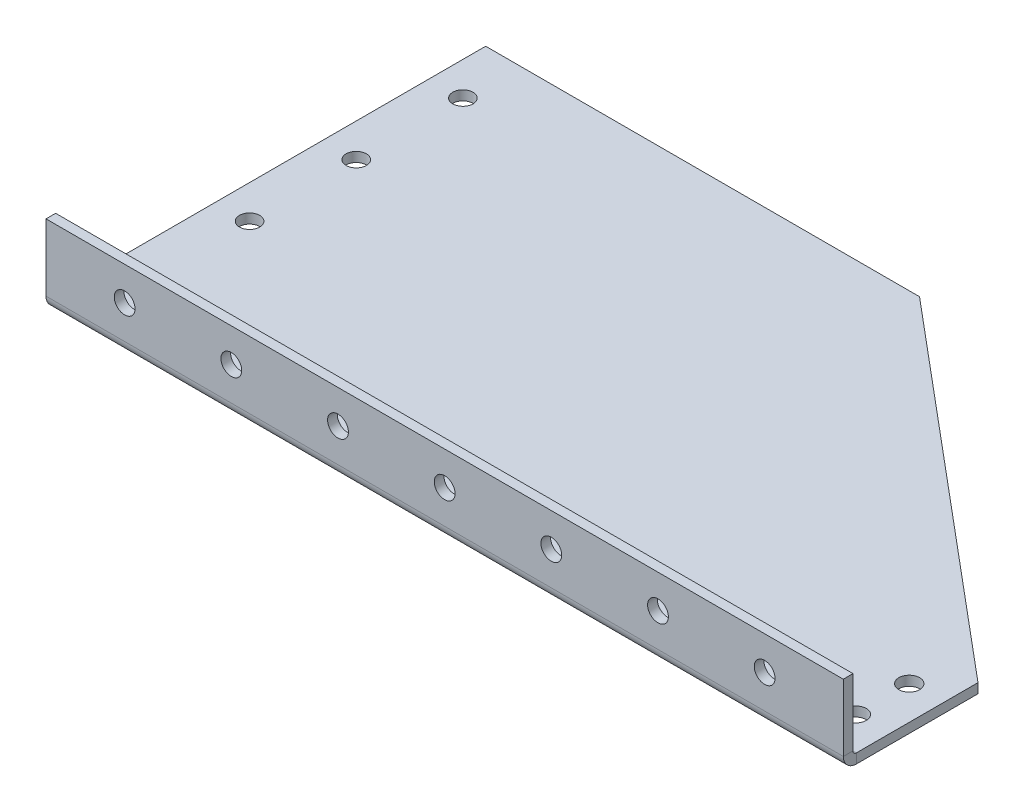
ISO-10303-21;
HEADER;
FILE_DESCRIPTION(('STEP AP214'),'2;1');
FILE_NAME('part.step','',(''),(''),'','','');
FILE_SCHEMA(('AUTOMOTIVE_DESIGN { 1 0 10303 214 1 1 1 1 }'));
ENDSEC;
DATA;
#1=APPLICATION_CONTEXT('core data for automotive mechanical design processes');
#2=APPLICATION_PROTOCOL_DEFINITION('international standard','automotive_design',2000,#1);
#3=PRODUCT_CONTEXT('',#1,'mechanical');
#4=PRODUCT('Part','Part','',(#3));
#5=PRODUCT_RELATED_PRODUCT_CATEGORY('part','',(#4));
#6=PRODUCT_DEFINITION_FORMATION('','',#4);
#7=PRODUCT_DEFINITION_CONTEXT('part definition',#1,'design');
#8=PRODUCT_DEFINITION('design','',#6,#7);
#9=PRODUCT_DEFINITION_SHAPE('','',#8);
#10=(LENGTH_UNIT() NAMED_UNIT(*) SI_UNIT(.MILLI.,.METRE.));
#11=(NAMED_UNIT(*) PLANE_ANGLE_UNIT() SI_UNIT($,.RADIAN.));
#12=(NAMED_UNIT(*) SI_UNIT($,.STERADIAN.) SOLID_ANGLE_UNIT());
#13=UNCERTAINTY_MEASURE_WITH_UNIT(LENGTH_MEASURE(1.E-05),#10,'distance_accuracy_value','');
#14=(GEOMETRIC_REPRESENTATION_CONTEXT(3) GLOBAL_UNCERTAINTY_ASSIGNED_CONTEXT((#13)) GLOBAL_UNIT_ASSIGNED_CONTEXT((#10,
#11,#12)) REPRESENTATION_CONTEXT('',''));
#15=CARTESIAN_POINT('',(0.,0.,0.));
#16=DIRECTION('',(0.,0.,1.));
#17=DIRECTION('',(1.,0.,0.));
#18=AXIS2_PLACEMENT_3D('',#15,#16,#17);
#19=CARTESIAN_POINT('',(106.398399999594,-2.3,80.677));
#20=DIRECTION('',(1.,0.,0.));
#21=DIRECTION('',(0.,0.,-1.));
#22=AXIS2_PLACEMENT_3D('',#19,#20,#21);
#23=PLANE('',#22);
#24=DIRECTION('',(0.,0.,-1.));
#25=VECTOR('',#24,1.);
#26=CARTESIAN_POINT('',(106.398399999594,-2.3,80.677));
#27=LINE('',#26,#25);
#28=CARTESIAN_POINT('',(106.398399999594,-2.30000000000001,79.8642));
#29=VERTEX_POINT('',#28);
#30=CARTESIAN_POINT('',(106.398399999594,-2.3,50.9046503403444));
#31=VERTEX_POINT('',#30);
#32=EDGE_CURVE('E59',#29,#31,#27,.T.);
#33=ORIENTED_EDGE('',*,*,#32,.T.);
#34=DIRECTION('',(0.,-1.,0.));
#35=VECTOR('',#34,1.);
#36=CARTESIAN_POINT('',(106.398399999594,16.75,50.9046503403444));
#37=LINE('',#36,#35);
#38=CARTESIAN_POINT('',(106.398399999594,0.,50.9046503403444));
#39=VERTEX_POINT('',#38);
#40=EDGE_CURVE('E134',#39,#31,#37,.T.);
#41=ORIENTED_EDGE('',*,*,#40,.F.);
#42=DIRECTION('',(0.,0.,-1.));
#43=VECTOR('',#42,1.);
#44=CARTESIAN_POINT('',(106.398399999594,0.,80.677));
#45=LINE('',#44,#43);
#46=CARTESIAN_POINT('',(106.398399999594,0.,79.8642000000001));
#47=VERTEX_POINT('',#46);
#48=EDGE_CURVE('E232',#47,#39,#45,.T.);
#49=ORIENTED_EDGE('',*,*,#48,.F.);
#50=DIRECTION('',(0.,-1.,0.));
#51=VECTOR('',#50,1.);
#52=CARTESIAN_POINT('',(106.398399999594,0.,79.8642000000001));
#53=LINE('',#52,#51);
#54=EDGE_CURVE('E209',#47,#29,#53,.T.);
#55=ORIENTED_EDGE('',*,*,#54,.T.);
#56=EDGE_LOOP('',(#33,#41,#49,#55));
#57=FACE_BOUND('',#56,.T.);
#58=ADVANCED_FACE('F50',(#57),#23,.T.);
#59=CARTESIAN_POINT('',(0.,-2.3,0.));
#60=DIRECTION('',(0.,1.,0.));
#61=DIRECTION('',(0.,0.,1.));
#62=AXIS2_PLACEMENT_3D('',#59,#60,#61);
#63=PLANE('',#62);
#64=CARTESIAN_POINT('',(-75.4832000004248,-2.3,-8.32179999999975));
#65=DIRECTION('',(0.,1.,0.));
#66=DIRECTION('',(0.,0.,1.));
#67=AXIS2_PLACEMENT_3D('',#64,#65,#66);
#68=CIRCLE('',#67,2.41299999999748);
#69=CARTESIAN_POINT('',(-75.4832000004248,-2.3,-5.90880000000227));
#70=VERTEX_POINT('',#69);
#71=EDGE_CURVE('E372',#70,#70,#68,.F.);
#72=ORIENTED_EDGE('',*,*,#71,.F.);
#73=EDGE_LOOP('',(#72));
#74=FACE_BOUND('',#73,.T.);
#75=CARTESIAN_POINT('',(98.4227999995948,-2.3,72.0042));
#76=DIRECTION('',(0.,1.,0.));
#77=DIRECTION('',(0.,0.,1.));
#78=AXIS2_PLACEMENT_3D('',#75,#76,#77);
#79=CIRCLE('',#78,2.4765);
#80=CARTESIAN_POINT('',(98.4227999995948,-2.3,74.4807));
#81=VERTEX_POINT('',#80);
#82=EDGE_CURVE('E385',#81,#81,#79,.F.);
#83=ORIENTED_EDGE('',*,*,#82,.F.);
#84=EDGE_LOOP('',(#83));
#85=FACE_BOUND('',#84,.T.);
#86=CARTESIAN_POINT('',(98.4227999995948,-2.3,59.3042));
#87=DIRECTION('',(0.,1.,0.));
#88=DIRECTION('',(0.,0.,1.));
#89=AXIS2_PLACEMENT_3D('',#86,#87,#88);
#90=CIRCLE('',#89,2.47649999999999);
#91=CARTESIAN_POINT('',(98.4227999995948,-2.3,61.7807));
#92=VERTEX_POINT('',#91);
#93=EDGE_CURVE('E393',#92,#92,#90,.F.);
#94=ORIENTED_EDGE('',*,*,#93,.F.);
#95=EDGE_LOOP('',(#94));
#96=FACE_BOUND('',#95,.T.);
#97=CARTESIAN_POINT('',(-75.4832000004245,-2.3,67.8782000000002));
#98=DIRECTION('',(0.,1.,0.));
#99=DIRECTION('',(0.,0.,1.));
#100=AXIS2_PLACEMENT_3D('',#97,#98,#99);
#101=CIRCLE('',#100,2.41299999999751);
#102=CARTESIAN_POINT('',(-75.4832000004245,-2.3,70.2911999999977));
#103=VERTEX_POINT('',#102);
#104=EDGE_CURVE('E410',#103,#103,#101,.F.);
#105=ORIENTED_EDGE('',*,*,#104,.F.);
#106=EDGE_LOOP('',(#105));
#107=FACE_BOUND('',#106,.T.);
#108=CARTESIAN_POINT('',(-75.4832000004246,-2.3,42.4782000000002));
#109=DIRECTION('',(0.,1.,0.));
#110=DIRECTION('',(0.,0.,1.));
#111=AXIS2_PLACEMENT_3D('',#108,#109,#110);
#112=CIRCLE('',#111,2.41299999999749);
#113=CARTESIAN_POINT('',(-75.4832000004246,-2.3,44.8911999999977));
#114=VERTEX_POINT('',#113);
#115=EDGE_CURVE('E402',#114,#114,#112,.F.);
#116=ORIENTED_EDGE('',*,*,#115,.F.);
#117=EDGE_LOOP('',(#116));
#118=FACE_BOUND('',#117,.T.);
#119=CARTESIAN_POINT('',(-75.4832000004247,-2.3,17.0782000000002));
#120=DIRECTION('',(0.,1.,0.));
#121=DIRECTION('',(0.,0.,1.));
#122=AXIS2_PLACEMENT_3D('',#119,#120,#121);
#123=CIRCLE('',#122,2.41299999999748);
#124=CARTESIAN_POINT('',(-75.4832000004247,-2.3,19.4911999999977));
#125=VERTEX_POINT('',#124);
#126=EDGE_CURVE('E394',#125,#125,#123,.F.);
#127=ORIENTED_EDGE('',*,*,#126,.F.);
#128=EDGE_LOOP('',(#127));
#129=FACE_BOUND('',#128,.T.);
#130=DIRECTION('',(0.76604444311898,0.,0.642787609686537));
#131=VECTOR('',#130,1.);
#132=CARTESIAN_POINT('',(18.8956087067203,-2.3,-22.5189095604884));
#133=LINE('',#132,#131);
#134=CARTESIAN_POINT('',(19.8455668891227,-2.3,-21.7218000000007));
#135=VERTEX_POINT('',#134);
#136=EDGE_CURVE('E131',#135,#31,#133,.T.);
#137=ORIENTED_EDGE('',*,*,#136,.T.);
#138=ORIENTED_EDGE('',*,*,#32,.F.);
#139=DIRECTION('',(1.,0.,0.));
#140=VECTOR('',#139,1.);
#141=CARTESIAN_POINT('',(106.398399999594,-2.30000000000001,79.8642));
#142=LINE('',#141,#140);
#143=CARTESIAN_POINT('',(-83.4588000004271,-2.3,79.8642000000001));
#144=VERTEX_POINT('',#143);
#145=EDGE_CURVE('E201',#29,#144,#142,.F.);
#146=ORIENTED_EDGE('',*,*,#145,.T.);
#147=DIRECTION('',(0.,0.,1.));
#148=VECTOR('',#147,1.);
#149=CARTESIAN_POINT('',(-83.4588000004271,-2.3,80.6770000000001));
#150=LINE('',#149,#148);
#151=CARTESIAN_POINT('',(-83.4588000004271,-2.3,-21.7218000000007));
#152=VERTEX_POINT('',#151);
#153=EDGE_CURVE('E143',#152,#144,#150,.T.);
#154=ORIENTED_EDGE('',*,*,#153,.F.);
#155=DIRECTION('',(1.,0.,0.));
#156=VECTOR('',#155,1.);
#157=CARTESIAN_POINT('',(0.,-2.3,-21.7218000000007));
#158=LINE('',#157,#156);
#159=EDGE_CURVE('E66',#152,#135,#158,.T.);
#160=ORIENTED_EDGE('',*,*,#159,.T.);
#161=EDGE_LOOP('',(#137,#138,#146,#154,#160));
#162=FACE_BOUND('',#161,.T.);
#163=ADVANCED_FACE('F141',(#74,#85,#96,#107,#118,#129,#162),#63,.F.);
#164=CARTESIAN_POINT('',(0.,0.,0.));
#165=DIRECTION('',(0.,1.,0.));
#166=DIRECTION('',(0.,0.,1.));
#167=AXIS2_PLACEMENT_3D('',#164,#165,#166);
#168=PLANE('',#167);
#169=CARTESIAN_POINT('',(-75.4832000004248,0.,-8.32179999999975));
#170=DIRECTION('',(0.,1.,0.));
#171=DIRECTION('',(0.,0.,1.));
#172=AXIS2_PLACEMENT_3D('',#169,#170,#171);
#173=CIRCLE('',#172,2.41299999999748);
#174=CARTESIAN_POINT('',(-75.4832000004248,0.,-5.90880000000227));
#175=VERTEX_POINT('',#174);
#176=EDGE_CURVE('E369',#175,#175,#173,.T.);
#177=ORIENTED_EDGE('',*,*,#176,.F.);
#178=EDGE_LOOP('',(#177));
#179=FACE_BOUND('',#178,.T.);
#180=CARTESIAN_POINT('',(98.4227999995948,0.,72.0042));
#181=DIRECTION('',(0.,1.,0.));
#182=DIRECTION('',(0.,0.,1.));
#183=AXIS2_PLACEMENT_3D('',#180,#181,#182);
#184=CIRCLE('',#183,2.4765);
#185=CARTESIAN_POINT('',(98.4227999995948,0.,74.4807));
#186=VERTEX_POINT('',#185);
#187=EDGE_CURVE('E389',#186,#186,#184,.T.);
#188=ORIENTED_EDGE('',*,*,#187,.F.);
#189=EDGE_LOOP('',(#188));
#190=FACE_BOUND('',#189,.T.);
#191=CARTESIAN_POINT('',(98.4227999995948,0.,59.3042));
#192=DIRECTION('',(0.,1.,0.));
#193=DIRECTION('',(0.,0.,1.));
#194=AXIS2_PLACEMENT_3D('',#191,#192,#193);
#195=CIRCLE('',#194,2.47649999999999);
#196=CARTESIAN_POINT('',(98.4227999995948,0.,61.7807));
#197=VERTEX_POINT('',#196);
#198=EDGE_CURVE('E414',#197,#197,#195,.T.);
#199=ORIENTED_EDGE('',*,*,#198,.F.);
#200=EDGE_LOOP('',(#199));
#201=FACE_BOUND('',#200,.T.);
#202=CARTESIAN_POINT('',(-75.4832000004245,0.,67.8782000000002));
#203=DIRECTION('',(0.,1.,0.));
#204=DIRECTION('',(0.,0.,1.));
#205=AXIS2_PLACEMENT_3D('',#202,#203,#204);
#206=CIRCLE('',#205,2.41299999999751);
#207=CARTESIAN_POINT('',(-75.4832000004245,0.,70.2911999999977));
#208=VERTEX_POINT('',#207);
#209=EDGE_CURVE('E406',#208,#208,#206,.T.);
#210=ORIENTED_EDGE('',*,*,#209,.F.);
#211=EDGE_LOOP('',(#210));
#212=FACE_BOUND('',#211,.T.);
#213=CARTESIAN_POINT('',(-75.4832000004246,0.,42.4782000000002));
#214=DIRECTION('',(0.,1.,0.));
#215=DIRECTION('',(0.,0.,1.));
#216=AXIS2_PLACEMENT_3D('',#213,#214,#215);
#217=CIRCLE('',#216,2.41299999999749);
#218=CARTESIAN_POINT('',(-75.4832000004246,0.,44.8911999999977));
#219=VERTEX_POINT('',#218);
#220=EDGE_CURVE('E398',#219,#219,#217,.T.);
#221=ORIENTED_EDGE('',*,*,#220,.F.);
#222=EDGE_LOOP('',(#221));
#223=FACE_BOUND('',#222,.T.);
#224=CARTESIAN_POINT('',(-75.4832000004247,0.,17.0782000000002));
#225=DIRECTION('',(0.,1.,0.));
#226=DIRECTION('',(0.,0.,1.));
#227=AXIS2_PLACEMENT_3D('',#224,#225,#226);
#228=CIRCLE('',#227,2.41299999999748);
#229=CARTESIAN_POINT('',(-75.4832000004247,0.,19.4911999999977));
#230=VERTEX_POINT('',#229);
#231=EDGE_CURVE('E382',#230,#230,#228,.T.);
#232=ORIENTED_EDGE('',*,*,#231,.F.);
#233=EDGE_LOOP('',(#232));
#234=FACE_BOUND('',#233,.T.);
#235=ORIENTED_EDGE('',*,*,#48,.T.);
#236=DIRECTION('',(-0.76604444311898,0.,-0.642787609686537));
#237=VECTOR('',#236,1.);
#238=CARTESIAN_POINT('',(18.8956087067203,0.,-22.5189095604884));
#239=LINE('',#238,#237);
#240=CARTESIAN_POINT('',(19.8455668891227,0.,-21.7218000000007));
#241=VERTEX_POINT('',#240);
#242=EDGE_CURVE('E11',#39,#241,#239,.T.);
#243=ORIENTED_EDGE('',*,*,#242,.T.);
#244=DIRECTION('',(-1.,0.,0.));
#245=VECTOR('',#244,1.);
#246=CARTESIAN_POINT('',(0.,0.,-21.7218000000007));
#247=LINE('',#246,#245);
#248=CARTESIAN_POINT('',(-83.4588000004271,0.,-21.7218000000007));
#249=VERTEX_POINT('',#248);
#250=EDGE_CURVE('E125',#241,#249,#247,.T.);
#251=ORIENTED_EDGE('',*,*,#250,.T.);
#252=DIRECTION('',(0.,0.,1.));
#253=VECTOR('',#252,1.);
#254=CARTESIAN_POINT('',(-83.4588000004271,0.,80.6770000000001));
#255=LINE('',#254,#253);
#256=CARTESIAN_POINT('',(-83.4588000004271,0.,79.8642000000001));
#257=VERTEX_POINT('',#256);
#258=EDGE_CURVE('E226',#249,#257,#255,.T.);
#259=ORIENTED_EDGE('',*,*,#258,.T.);
#260=DIRECTION('',(1.,0.,0.));
#261=VECTOR('',#260,1.);
#262=CARTESIAN_POINT('',(106.398399999594,0.,79.8642000000001));
#263=LINE('',#262,#261);
#264=EDGE_CURVE('E74',#47,#257,#263,.F.);
#265=ORIENTED_EDGE('',*,*,#264,.F.);
#266=EDGE_LOOP('',(#235,#243,#251,#259,#265));
#267=FACE_BOUND('',#266,.T.);
#268=ADVANCED_FACE('F239',(#179,#190,#201,#212,#223,#234,#267),#168,.T.);
#269=CARTESIAN_POINT('',(-83.4588000004271,-2.3,80.6770000000001));
#270=DIRECTION('',(-1.,0.,0.));
#271=DIRECTION('',(0.,0.,1.));
#272=AXIS2_PLACEMENT_3D('',#269,#270,#271);
#273=PLANE('',#272);
#274=ORIENTED_EDGE('',*,*,#258,.F.);
#275=DIRECTION('',(0.,-1.,0.));
#276=VECTOR('',#275,1.);
#277=CARTESIAN_POINT('',(-83.4588000004271,16.75,-21.7218000000007));
#278=LINE('',#277,#276);
#279=EDGE_CURVE('E128',#249,#152,#278,.T.);
#280=ORIENTED_EDGE('',*,*,#279,.T.);
#281=ORIENTED_EDGE('',*,*,#153,.T.);
#282=DIRECTION('',(0.,-1.,0.));
#283=VECTOR('',#282,1.);
#284=CARTESIAN_POINT('',(-83.4588000004271,0.,79.8642000000001));
#285=LINE('',#284,#283);
#286=EDGE_CURVE('E222',#257,#144,#285,.T.);
#287=ORIENTED_EDGE('',*,*,#286,.F.);
#288=EDGE_LOOP('',(#274,#280,#281,#287));
#289=FACE_BOUND('',#288,.T.);
#290=ADVANCED_FACE('F52',(#289),#273,.T.);
#291=CARTESIAN_POINT('',(-83.4588000004271,0.812800000000002,79.8642000000001));
#292=DIRECTION('',(-1.,0.,0.));
#293=DIRECTION('',(0.,0.,1.));
#294=AXIS2_PLACEMENT_3D('',#291,#292,#293);
#295=PLANE('',#294);
#296=DIRECTION('',(0.,0.,1.));
#297=VECTOR('',#296,1.);
#298=CARTESIAN_POINT('',(-83.4588000004271,0.812800000000002,80.6770000000001));
#299=LINE('',#298,#297);
#300=CARTESIAN_POINT('',(-83.4588000004271,0.8128,80.6770000000001));
#301=VERTEX_POINT('',#300);
#302=CARTESIAN_POINT('',(-83.4588000004271,0.812799999999992,82.9770000000001));
#303=VERTEX_POINT('',#302);
#304=EDGE_CURVE('E156',#301,#303,#299,.T.);
#305=ORIENTED_EDGE('',*,*,#304,.F.);
#306=CARTESIAN_POINT('',(-83.4588000004271,0.812800000000002,79.8642000000001));
#307=DIRECTION('',(1.,0.,0.));
#308=DIRECTION('',(0.,0.,-1.));
#309=AXIS2_PLACEMENT_3D('',#306,#307,#308);
#310=CIRCLE('',#309,0.812800000000016);
#311=EDGE_CURVE('E213',#257,#301,#310,.F.);
#312=ORIENTED_EDGE('',*,*,#311,.F.);
#313=ORIENTED_EDGE('',*,*,#286,.T.);
#314=CARTESIAN_POINT('',(-83.4588000004271,0.812800000000002,79.8642000000001));
#315=DIRECTION('',(1.,0.,0.));
#316=DIRECTION('',(0.,0.,-1.));
#317=AXIS2_PLACEMENT_3D('',#314,#315,#316);
#318=CIRCLE('',#317,3.11280000000002);
#319=EDGE_CURVE('E204',#144,#303,#318,.F.);
#320=ORIENTED_EDGE('',*,*,#319,.T.);
#321=EDGE_LOOP('',(#305,#312,#313,#320));
#322=FACE_BOUND('',#321,.T.);
#323=ADVANCED_FACE('F272',(#322),#295,.T.);
#324=CARTESIAN_POINT('',(106.398399999594,0.812800000000002,79.8642000000001));
#325=DIRECTION('',(-1.,0.,0.));
#326=DIRECTION('',(0.,0.,1.));
#327=AXIS2_PLACEMENT_3D('',#324,#325,#326);
#328=PLANE('',#327);
#329=CARTESIAN_POINT('',(106.398399999594,0.812800000000002,79.8642000000001));
#330=DIRECTION('',(1.,0.,0.));
#331=DIRECTION('',(0.,0.,-1.));
#332=AXIS2_PLACEMENT_3D('',#329,#330,#331);
#333=CIRCLE('',#332,0.812800000000016);
#334=CARTESIAN_POINT('',(106.398399999594,0.8128,80.6770000000001));
#335=VERTEX_POINT('',#334);
#336=EDGE_CURVE('E197',#335,#47,#333,.T.);
#337=ORIENTED_EDGE('',*,*,#336,.F.);
#338=DIRECTION('',(0.,0.,1.));
#339=VECTOR('',#338,1.);
#340=CARTESIAN_POINT('',(106.398399999594,0.812800000000002,80.677));
#341=LINE('',#340,#339);
#342=CARTESIAN_POINT('',(106.398399999594,0.812800000000002,82.977));
#343=VERTEX_POINT('',#342);
#344=EDGE_CURVE('E160',#335,#343,#341,.T.);
#345=ORIENTED_EDGE('',*,*,#344,.T.);
#346=CARTESIAN_POINT('',(106.398399999594,0.812800000000002,79.8642000000001));
#347=DIRECTION('',(1.,0.,0.));
#348=DIRECTION('',(0.,0.,-1.));
#349=AXIS2_PLACEMENT_3D('',#346,#347,#348);
#350=CIRCLE('',#349,3.11280000000002);
#351=EDGE_CURVE('E205',#343,#29,#350,.T.);
#352=ORIENTED_EDGE('',*,*,#351,.T.);
#353=ORIENTED_EDGE('',*,*,#54,.F.);
#354=EDGE_LOOP('',(#337,#345,#352,#353));
#355=FACE_BOUND('',#354,.T.);
#356=ADVANCED_FACE('F245',(#355),#328,.F.);
#357=CARTESIAN_POINT('',(106.398399999594,0.812800000000002,79.8642000000001));
#358=DIRECTION('',(1.,0.,0.));
#359=DIRECTION('',(0.,0.,1.));
#360=AXIS2_PLACEMENT_3D('',#357,#358,#359);
#361=CYLINDRICAL_SURFACE('',#360,3.11280000000002);
#362=ORIENTED_EDGE('',*,*,#145,.F.);
#363=ORIENTED_EDGE('',*,*,#351,.F.);
#364=DIRECTION('',(1.,0.,0.));
#365=VECTOR('',#364,1.);
#366=CARTESIAN_POINT('',(0.,0.812800000000002,82.9770000000001));
#367=LINE('',#366,#365);
#368=EDGE_CURVE('E164',#303,#343,#367,.T.);
#369=ORIENTED_EDGE('',*,*,#368,.F.);
#370=ORIENTED_EDGE('',*,*,#319,.F.);
#371=EDGE_LOOP('',(#362,#363,#369,#370));
#372=FACE_BOUND('',#371,.T.);
#373=ADVANCED_FACE('F270',(#372),#361,.T.);
#374=CARTESIAN_POINT('',(106.398399999594,0.812800000000002,79.8642000000001));
#375=DIRECTION('',(1.,0.,0.));
#376=DIRECTION('',(0.,0.,1.));
#377=AXIS2_PLACEMENT_3D('',#374,#375,#376);
#378=CYLINDRICAL_SURFACE('',#377,0.812800000000016);
#379=ORIENTED_EDGE('',*,*,#264,.T.);
#380=ORIENTED_EDGE('',*,*,#311,.T.);
#381=DIRECTION('',(1.,0.,0.));
#382=VECTOR('',#381,1.);
#383=CARTESIAN_POINT('',(-83.4588000004271,0.812800000000002,80.6770000000001));
#384=LINE('',#383,#382);
#385=EDGE_CURVE('E157',#301,#335,#384,.T.);
#386=ORIENTED_EDGE('',*,*,#385,.T.);
#387=ORIENTED_EDGE('',*,*,#336,.T.);
#388=EDGE_LOOP('',(#379,#380,#386,#387));
#389=FACE_BOUND('',#388,.T.);
#390=ADVANCED_FACE('F247',(#389),#378,.F.);
#391=CARTESIAN_POINT('',(106.398399999594,0.,82.977));
#392=DIRECTION('',(1.,0.,0.));
#393=DIRECTION('',(0.,0.,-1.));
#394=AXIS2_PLACEMENT_3D('',#391,#392,#393);
#395=PLANE('',#394);
#396=DIRECTION('',(0.,-1.,0.));
#397=VECTOR('',#396,1.);
#398=CARTESIAN_POINT('',(106.398399999594,0.,82.977));
#399=LINE('',#398,#397);
#400=CARTESIAN_POINT('',(106.398399999594,16.75,82.9770000000001));
#401=VERTEX_POINT('',#400);
#402=EDGE_CURVE('E180',#401,#343,#399,.T.);
#403=ORIENTED_EDGE('',*,*,#402,.T.);
#404=ORIENTED_EDGE('',*,*,#344,.F.);
#405=DIRECTION('',(0.,-1.,0.));
#406=VECTOR('',#405,1.);
#407=CARTESIAN_POINT('',(106.398399999594,0.,80.677));
#408=LINE('',#407,#406);
#409=CARTESIAN_POINT('',(106.398399999594,16.75,80.6770000000001));
#410=VERTEX_POINT('',#409);
#411=EDGE_CURVE('E176',#410,#335,#408,.T.);
#412=ORIENTED_EDGE('',*,*,#411,.F.);
#413=DIRECTION('',(0.,0.,-1.));
#414=VECTOR('',#413,1.);
#415=CARTESIAN_POINT('',(106.398399999594,16.75,82.9770000000001));
#416=LINE('',#415,#414);
#417=EDGE_CURVE('E194',#401,#410,#416,.T.);
#418=ORIENTED_EDGE('',*,*,#417,.F.);
#419=EDGE_LOOP('',(#403,#404,#412,#418));
#420=FACE_BOUND('',#419,.T.);
#421=ADVANCED_FACE('F264',(#420),#395,.T.);
#422=CARTESIAN_POINT('',(-83.4588000004271,16.75,82.9770000000001));
#423=DIRECTION('',(-1.,0.,0.));
#424=DIRECTION('',(0.,-1.,0.));
#425=AXIS2_PLACEMENT_3D('',#422,#423,#424);
#426=PLANE('',#425);
#427=DIRECTION('',(0.,1.,0.));
#428=VECTOR('',#427,1.);
#429=CARTESIAN_POINT('',(-83.4588000004271,16.75,80.6770000000001));
#430=LINE('',#429,#428);
#431=CARTESIAN_POINT('',(-83.4588000004271,16.75,80.6770000000001));
#432=VERTEX_POINT('',#431);
#433=EDGE_CURVE('E171',#301,#432,#430,.T.);
#434=ORIENTED_EDGE('',*,*,#433,.F.);
#435=ORIENTED_EDGE('',*,*,#304,.T.);
#436=DIRECTION('',(0.,1.,0.));
#437=VECTOR('',#436,1.);
#438=CARTESIAN_POINT('',(-83.4588000004271,16.75,82.9770000000001));
#439=LINE('',#438,#437);
#440=CARTESIAN_POINT('',(-83.4588000004271,16.75,82.9770000000001));
#441=VERTEX_POINT('',#440);
#442=EDGE_CURVE('E172',#303,#441,#439,.T.);
#443=ORIENTED_EDGE('',*,*,#442,.T.);
#444=DIRECTION('',(0.,0.,-1.));
#445=VECTOR('',#444,1.);
#446=CARTESIAN_POINT('',(-83.4588000004271,16.75,82.9770000000001));
#447=LINE('',#446,#445);
#448=EDGE_CURVE('E184',#441,#432,#447,.T.);
#449=ORIENTED_EDGE('',*,*,#448,.T.);
#450=EDGE_LOOP('',(#434,#435,#443,#449));
#451=FACE_BOUND('',#450,.T.);
#452=ADVANCED_FACE('F256',(#451),#426,.T.);
#453=CARTESIAN_POINT('',(0.,-2.75401938296306E-13,82.9770000000001));
#454=DIRECTION('',(0.,0.,1.));
#455=DIRECTION('',(0.,-1.,0.));
#456=AXIS2_PLACEMENT_3D('',#453,#454,#455);
#457=PLANE('',#456);
#458=CARTESIAN_POINT('',(-64.7302000004178,8.78140000000003,82.9770000000001));
#459=DIRECTION('',(0.,0.,1.));
#460=DIRECTION('',(0.,-1.,0.));
#461=AXIS2_PLACEMENT_3D('',#458,#459,#460);
#462=CIRCLE('',#461,2.4765);
#463=CARTESIAN_POINT('',(-64.7302000004178,6.30490000000002,82.9770000000001));
#464=VERTEX_POINT('',#463);
#465=EDGE_CURVE('E427',#464,#464,#462,.F.);
#466=ORIENTED_EDGE('',*,*,#465,.T.);
#467=EDGE_LOOP('',(#466));
#468=FACE_BOUND('',#467,.T.);
#469=CARTESIAN_POINT('',(-39.3302000004178,8.78140000000003,82.9770000000001));
#470=DIRECTION('',(0.,0.,1.));
#471=DIRECTION('',(0.,-1.,0.));
#472=AXIS2_PLACEMENT_3D('',#469,#470,#471);
#473=CIRCLE('',#472,2.4765);
#474=CARTESIAN_POINT('',(-39.3302000004178,6.30490000000003,82.9770000000001));
#475=VERTEX_POINT('',#474);
#476=EDGE_CURVE('E431',#475,#475,#473,.F.);
#477=ORIENTED_EDGE('',*,*,#476,.T.);
#478=EDGE_LOOP('',(#477));
#479=FACE_BOUND('',#478,.T.);
#480=CARTESIAN_POINT('',(-13.9302000004178,8.78140000000003,82.9770000000001));
#481=DIRECTION('',(0.,0.,1.));
#482=DIRECTION('',(0.,-1.,0.));
#483=AXIS2_PLACEMENT_3D('',#480,#481,#482);
#484=CIRCLE('',#483,2.4765);
#485=CARTESIAN_POINT('',(-13.9302000004178,6.30490000000002,82.9770000000001));
#486=VERTEX_POINT('',#485);
#487=EDGE_CURVE('E439',#486,#486,#484,.F.);
#488=ORIENTED_EDGE('',*,*,#487,.T.);
#489=EDGE_LOOP('',(#488));
#490=FACE_BOUND('',#489,.T.);
#491=CARTESIAN_POINT('',(11.4697999995822,8.78140000000003,82.9770000000001));
#492=DIRECTION('',(0.,0.,1.));
#493=DIRECTION('',(0.,-1.,0.));
#494=AXIS2_PLACEMENT_3D('',#491,#492,#493);
#495=CIRCLE('',#494,2.4765);
#496=CARTESIAN_POINT('',(11.4697999995822,6.30490000000003,82.9770000000001));
#497=VERTEX_POINT('',#496);
#498=EDGE_CURVE('E447',#497,#497,#495,.F.);
#499=ORIENTED_EDGE('',*,*,#498,.T.);
#500=EDGE_LOOP('',(#499));
#501=FACE_BOUND('',#500,.T.);
#502=CARTESIAN_POINT('',(36.8697999995822,8.78140000000003,82.9770000000001));
#503=DIRECTION('',(0.,0.,1.));
#504=DIRECTION('',(0.,-1.,0.));
#505=AXIS2_PLACEMENT_3D('',#502,#503,#504);
#506=CIRCLE('',#505,2.4765);
#507=CARTESIAN_POINT('',(36.8697999995822,6.30490000000003,82.9770000000001));
#508=VERTEX_POINT('',#507);
#509=EDGE_CURVE('E455',#508,#508,#506,.F.);
#510=ORIENTED_EDGE('',*,*,#509,.T.);
#511=EDGE_LOOP('',(#510));
#512=FACE_BOUND('',#511,.T.);
#513=CARTESIAN_POINT('',(62.2697999995822,8.78140000000003,82.9770000000001));
#514=DIRECTION('',(0.,0.,1.));
#515=DIRECTION('',(0.,-1.,0.));
#516=AXIS2_PLACEMENT_3D('',#513,#514,#515);
#517=CIRCLE('',#516,2.4765);
#518=CARTESIAN_POINT('',(62.2697999995822,6.30490000000003,82.9770000000001));
#519=VERTEX_POINT('',#518);
#520=EDGE_CURVE('E463',#519,#519,#517,.F.);
#521=ORIENTED_EDGE('',*,*,#520,.T.);
#522=EDGE_LOOP('',(#521));
#523=FACE_BOUND('',#522,.T.);
#524=CARTESIAN_POINT('',(87.6697999995822,8.78140000000003,82.9770000000001));
#525=DIRECTION('',(0.,0.,1.));
#526=DIRECTION('',(0.,-1.,0.));
#527=AXIS2_PLACEMENT_3D('',#524,#525,#526);
#528=CIRCLE('',#527,2.4765);
#529=CARTESIAN_POINT('',(87.6697999995822,6.30490000000002,82.9770000000001));
#530=VERTEX_POINT('',#529);
#531=EDGE_CURVE('E381',#530,#530,#528,.F.);
#532=ORIENTED_EDGE('',*,*,#531,.T.);
#533=EDGE_LOOP('',(#532));
#534=FACE_BOUND('',#533,.T.);
#535=ORIENTED_EDGE('',*,*,#442,.F.);
#536=ORIENTED_EDGE('',*,*,#368,.T.);
#537=ORIENTED_EDGE('',*,*,#402,.F.);
#538=DIRECTION('',(1.,0.,0.));
#539=VECTOR('',#538,1.);
#540=CARTESIAN_POINT('',(106.398399999594,16.75,82.9770000000001));
#541=LINE('',#540,#539);
#542=EDGE_CURVE('E175',#441,#401,#541,.T.);
#543=ORIENTED_EDGE('',*,*,#542,.F.);
#544=EDGE_LOOP('',(#535,#536,#537,#543));
#545=FACE_BOUND('',#544,.T.);
#546=ADVANCED_FACE('F267',(#468,#479,#490,#501,#512,#523,#534,#545),#457,.T.);
#547=CARTESIAN_POINT('',(0.,-2.67371531216967E-13,80.6770000000001));
#548=DIRECTION('',(0.,0.,1.));
#549=DIRECTION('',(0.,-1.,0.));
#550=AXIS2_PLACEMENT_3D('',#547,#548,#549);
#551=PLANE('',#550);
#552=CARTESIAN_POINT('',(-64.7302000004178,8.78140000000004,80.6770000000001));
#553=DIRECTION('',(0.,0.,-1.));
#554=DIRECTION('',(0.,1.,0.));
#555=AXIS2_PLACEMENT_3D('',#552,#553,#554);
#556=CIRCLE('',#555,2.4765);
#557=CARTESIAN_POINT('',(-64.7302000004178,11.2579,80.6770000000001));
#558=VERTEX_POINT('',#557);
#559=EDGE_CURVE('E138',#558,#558,#556,.T.);
#560=ORIENTED_EDGE('',*,*,#559,.F.);
#561=EDGE_LOOP('',(#560));
#562=FACE_BOUND('',#561,.T.);
#563=CARTESIAN_POINT('',(-39.3302000004178,8.78140000000004,80.6770000000001));
#564=DIRECTION('',(0.,0.,-1.));
#565=DIRECTION('',(0.,1.,0.));
#566=AXIS2_PLACEMENT_3D('',#563,#564,#565);
#567=CIRCLE('',#566,2.4765);
#568=CARTESIAN_POINT('',(-39.3302000004178,11.2579,80.6770000000001));
#569=VERTEX_POINT('',#568);
#570=EDGE_CURVE('E435',#569,#569,#567,.T.);
#571=ORIENTED_EDGE('',*,*,#570,.F.);
#572=EDGE_LOOP('',(#571));
#573=FACE_BOUND('',#572,.T.);
#574=CARTESIAN_POINT('',(-13.9302000004178,8.78140000000004,80.6770000000001));
#575=DIRECTION('',(0.,0.,-1.));
#576=DIRECTION('',(0.,1.,0.));
#577=AXIS2_PLACEMENT_3D('',#574,#575,#576);
#578=CIRCLE('',#577,2.4765);
#579=CARTESIAN_POINT('',(-13.9302000004178,11.2579,80.6770000000001));
#580=VERTEX_POINT('',#579);
#581=EDGE_CURVE('E443',#580,#580,#578,.T.);
#582=ORIENTED_EDGE('',*,*,#581,.F.);
#583=EDGE_LOOP('',(#582));
#584=FACE_BOUND('',#583,.T.);
#585=CARTESIAN_POINT('',(11.4697999995822,8.78140000000004,80.6770000000001));
#586=DIRECTION('',(0.,0.,-1.));
#587=DIRECTION('',(0.,1.,0.));
#588=AXIS2_PLACEMENT_3D('',#585,#586,#587);
#589=CIRCLE('',#588,2.4765);
#590=CARTESIAN_POINT('',(11.4697999995822,11.2579,80.6770000000001));
#591=VERTEX_POINT('',#590);
#592=EDGE_CURVE('E451',#591,#591,#589,.T.);
#593=ORIENTED_EDGE('',*,*,#592,.F.);
#594=EDGE_LOOP('',(#593));
#595=FACE_BOUND('',#594,.T.);
#596=CARTESIAN_POINT('',(36.8697999995822,8.78140000000004,80.6770000000001));
#597=DIRECTION('',(0.,0.,-1.));
#598=DIRECTION('',(0.,1.,0.));
#599=AXIS2_PLACEMENT_3D('',#596,#597,#598);
#600=CIRCLE('',#599,2.4765);
#601=CARTESIAN_POINT('',(36.8697999995822,11.2579,80.6770000000001));
#602=VERTEX_POINT('',#601);
#603=EDGE_CURVE('E459',#602,#602,#600,.T.);
#604=ORIENTED_EDGE('',*,*,#603,.F.);
#605=EDGE_LOOP('',(#604));
#606=FACE_BOUND('',#605,.T.);
#607=CARTESIAN_POINT('',(62.2697999995822,8.78140000000004,80.6770000000001));
#608=DIRECTION('',(0.,0.,-1.));
#609=DIRECTION('',(0.,1.,0.));
#610=AXIS2_PLACEMENT_3D('',#607,#608,#609);
#611=CIRCLE('',#610,2.4765);
#612=CARTESIAN_POINT('',(62.2697999995822,11.2579,80.6770000000001));
#613=VERTEX_POINT('',#612);
#614=EDGE_CURVE('E467',#613,#613,#611,.T.);
#615=ORIENTED_EDGE('',*,*,#614,.F.);
#616=EDGE_LOOP('',(#615));
#617=FACE_BOUND('',#616,.T.);
#618=CARTESIAN_POINT('',(87.6697999995822,8.78140000000004,80.6770000000001));
#619=DIRECTION('',(0.,0.,-1.));
#620=DIRECTION('',(0.,1.,0.));
#621=AXIS2_PLACEMENT_3D('',#618,#619,#620);
#622=CIRCLE('',#621,2.4765);
#623=CARTESIAN_POINT('',(87.6697999995822,11.2579,80.6770000000001));
#624=VERTEX_POINT('',#623);
#625=EDGE_CURVE('E374',#624,#624,#622,.T.);
#626=ORIENTED_EDGE('',*,*,#625,.F.);
#627=EDGE_LOOP('',(#626));
#628=FACE_BOUND('',#627,.T.);
#629=ORIENTED_EDGE('',*,*,#385,.F.);
#630=ORIENTED_EDGE('',*,*,#433,.T.);
#631=DIRECTION('',(1.,0.,0.));
#632=VECTOR('',#631,1.);
#633=CARTESIAN_POINT('',(106.398399999594,16.75,80.6770000000001));
#634=LINE('',#633,#632);
#635=EDGE_CURVE('E187',#432,#410,#634,.T.);
#636=ORIENTED_EDGE('',*,*,#635,.T.);
#637=ORIENTED_EDGE('',*,*,#411,.T.);
#638=EDGE_LOOP('',(#629,#630,#636,#637));
#639=FACE_BOUND('',#638,.T.);
#640=ADVANCED_FACE('F252',(#562,#573,#584,#595,#606,#617,#628,#639),#551,.F.);
#641=CARTESIAN_POINT('',(106.398399999594,16.75,82.9770000000001));
#642=DIRECTION('',(0.,1.,0.));
#643=DIRECTION('',(0.,0.,1.));
#644=AXIS2_PLACEMENT_3D('',#641,#642,#643);
#645=PLANE('',#644);
#646=ORIENTED_EDGE('',*,*,#635,.F.);
#647=ORIENTED_EDGE('',*,*,#448,.F.);
#648=ORIENTED_EDGE('',*,*,#542,.T.);
#649=ORIENTED_EDGE('',*,*,#417,.T.);
#650=EDGE_LOOP('',(#646,#647,#648,#649));
#651=FACE_BOUND('',#650,.T.);
#652=ADVANCED_FACE('F262',(#651),#645,.T.);
#653=CARTESIAN_POINT('',(18.8956087067203,16.75,-22.5189095604884));
#654=DIRECTION('',(0.642787609686537,0.,-0.76604444311898));
#655=DIRECTION('',(-0.76604444311898,0.,-0.642787609686537));
#656=AXIS2_PLACEMENT_3D('',#653,#654,#655);
#657=PLANE('',#656);
#658=ORIENTED_EDGE('',*,*,#40,.T.);
#659=ORIENTED_EDGE('',*,*,#136,.F.);
#660=DIRECTION('',(0.,-1.,0.));
#661=VECTOR('',#660,1.);
#662=CARTESIAN_POINT('',(19.8455668891227,16.75,-21.7218000000007));
#663=LINE('',#662,#661);
#664=EDGE_CURVE('E121',#241,#135,#663,.T.);
#665=ORIENTED_EDGE('',*,*,#664,.F.);
#666=ORIENTED_EDGE('',*,*,#242,.F.);
#667=EDGE_LOOP('',(#658,#659,#665,#666));
#668=FACE_BOUND('',#667,.T.);
#669=ADVANCED_FACE('F132',(#668),#657,.T.);
#670=CARTESIAN_POINT('',(0.,16.75,-21.7218000000007));
#671=DIRECTION('',(0.,0.,-1.));
#672=DIRECTION('',(-1.,0.,0.));
#673=AXIS2_PLACEMENT_3D('',#670,#671,#672);
#674=PLANE('',#673);
#675=ORIENTED_EDGE('',*,*,#664,.T.);
#676=ORIENTED_EDGE('',*,*,#159,.F.);
#677=ORIENTED_EDGE('',*,*,#279,.F.);
#678=ORIENTED_EDGE('',*,*,#250,.F.);
#679=EDGE_LOOP('',(#675,#676,#677,#678));
#680=FACE_BOUND('',#679,.T.);
#681=ADVANCED_FACE('F123',(#680),#674,.T.);
#682=CARTESIAN_POINT('',(87.6697999995822,8.78140000000003,82.9780000000002));
#683=DIRECTION('',(0.,0.,-1.));
#684=DIRECTION('',(0.,1.,0.));
#685=AXIS2_PLACEMENT_3D('',#682,#683,#684);
#686=CYLINDRICAL_SURFACE('',#685,2.4765);
#687=ORIENTED_EDGE('',*,*,#531,.F.);
#688=EDGE_LOOP('',(#687));
#689=FACE_BOUND('',#688,.T.);
#690=ORIENTED_EDGE('',*,*,#625,.T.);
#691=EDGE_LOOP('',(#690));
#692=FACE_BOUND('',#691,.T.);
#693=ADVANCED_FACE('F313',(#689,#692),#686,.F.);
#694=CARTESIAN_POINT('',(62.2697999995822,8.78140000000003,82.9780000000002));
#695=DIRECTION('',(0.,0.,-1.));
#696=DIRECTION('',(0.,1.,0.));
#697=AXIS2_PLACEMENT_3D('',#694,#695,#696);
#698=CYLINDRICAL_SURFACE('',#697,2.4765);
#699=ORIENTED_EDGE('',*,*,#520,.F.);
#700=EDGE_LOOP('',(#699));
#701=FACE_BOUND('',#700,.T.);
#702=ORIENTED_EDGE('',*,*,#614,.T.);
#703=EDGE_LOOP('',(#702));
#704=FACE_BOUND('',#703,.T.);
#705=ADVANCED_FACE('F316',(#701,#704),#698,.F.);
#706=CARTESIAN_POINT('',(36.8697999995822,8.78140000000003,82.9780000000002));
#707=DIRECTION('',(0.,0.,-1.));
#708=DIRECTION('',(0.,1.,0.));
#709=AXIS2_PLACEMENT_3D('',#706,#707,#708);
#710=CYLINDRICAL_SURFACE('',#709,2.4765);
#711=ORIENTED_EDGE('',*,*,#509,.F.);
#712=EDGE_LOOP('',(#711));
#713=FACE_BOUND('',#712,.T.);
#714=ORIENTED_EDGE('',*,*,#603,.T.);
#715=EDGE_LOOP('',(#714));
#716=FACE_BOUND('',#715,.T.);
#717=ADVANCED_FACE('F320',(#713,#716),#710,.F.);
#718=CARTESIAN_POINT('',(11.4697999995822,8.78140000000003,82.9780000000002));
#719=DIRECTION('',(0.,0.,-1.));
#720=DIRECTION('',(0.,1.,0.));
#721=AXIS2_PLACEMENT_3D('',#718,#719,#720);
#722=CYLINDRICAL_SURFACE('',#721,2.4765);
#723=ORIENTED_EDGE('',*,*,#498,.F.);
#724=EDGE_LOOP('',(#723));
#725=FACE_BOUND('',#724,.T.);
#726=ORIENTED_EDGE('',*,*,#592,.T.);
#727=EDGE_LOOP('',(#726));
#728=FACE_BOUND('',#727,.T.);
#729=ADVANCED_FACE('F324',(#725,#728),#722,.F.);
#730=CARTESIAN_POINT('',(-13.9302000004178,8.78140000000003,82.9780000000002));
#731=DIRECTION('',(0.,0.,-1.));
#732=DIRECTION('',(0.,1.,0.));
#733=AXIS2_PLACEMENT_3D('',#730,#731,#732);
#734=CYLINDRICAL_SURFACE('',#733,2.4765);
#735=ORIENTED_EDGE('',*,*,#487,.F.);
#736=EDGE_LOOP('',(#735));
#737=FACE_BOUND('',#736,.T.);
#738=ORIENTED_EDGE('',*,*,#581,.T.);
#739=EDGE_LOOP('',(#738));
#740=FACE_BOUND('',#739,.T.);
#741=ADVANCED_FACE('F328',(#737,#740),#734,.F.);
#742=CARTESIAN_POINT('',(-39.3302000004178,8.78140000000003,82.9780000000002));
#743=DIRECTION('',(0.,0.,-1.));
#744=DIRECTION('',(0.,1.,0.));
#745=AXIS2_PLACEMENT_3D('',#742,#743,#744);
#746=CYLINDRICAL_SURFACE('',#745,2.4765);
#747=ORIENTED_EDGE('',*,*,#476,.F.);
#748=EDGE_LOOP('',(#747));
#749=FACE_BOUND('',#748,.T.);
#750=ORIENTED_EDGE('',*,*,#570,.T.);
#751=EDGE_LOOP('',(#750));
#752=FACE_BOUND('',#751,.T.);
#753=ADVANCED_FACE('F332',(#749,#752),#746,.F.);
#754=CARTESIAN_POINT('',(-64.7302000004178,8.78140000000003,82.9780000000002));
#755=DIRECTION('',(0.,0.,-1.));
#756=DIRECTION('',(0.,1.,0.));
#757=AXIS2_PLACEMENT_3D('',#754,#755,#756);
#758=CYLINDRICAL_SURFACE('',#757,2.4765);
#759=ORIENTED_EDGE('',*,*,#465,.F.);
#760=EDGE_LOOP('',(#759));
#761=FACE_BOUND('',#760,.T.);
#762=ORIENTED_EDGE('',*,*,#559,.T.);
#763=EDGE_LOOP('',(#762));
#764=FACE_BOUND('',#763,.T.);
#765=ADVANCED_FACE('F336',(#761,#764),#758,.F.);
#766=CARTESIAN_POINT('',(-75.4832000004247,-2.30100000000001,17.0782000000002));
#767=DIRECTION('',(0.,1.,0.));
#768=DIRECTION('',(0.,0.,1.));
#769=AXIS2_PLACEMENT_3D('',#766,#767,#768);
#770=CYLINDRICAL_SURFACE('',#769,2.41299999999748);
#771=ORIENTED_EDGE('',*,*,#231,.T.);
#772=EDGE_LOOP('',(#771));
#773=FACE_BOUND('',#772,.T.);
#774=ORIENTED_EDGE('',*,*,#126,.T.);
#775=EDGE_LOOP('',(#774));
#776=FACE_BOUND('',#775,.T.);
#777=ADVANCED_FACE('F340',(#773,#776),#770,.F.);
#778=CARTESIAN_POINT('',(-75.4832000004246,-2.30100000000001,42.4782000000002));
#779=DIRECTION('',(0.,1.,0.));
#780=DIRECTION('',(0.,0.,1.));
#781=AXIS2_PLACEMENT_3D('',#778,#779,#780);
#782=CYLINDRICAL_SURFACE('',#781,2.41299999999749);
#783=ORIENTED_EDGE('',*,*,#220,.T.);
#784=EDGE_LOOP('',(#783));
#785=FACE_BOUND('',#784,.T.);
#786=ORIENTED_EDGE('',*,*,#115,.T.);
#787=EDGE_LOOP('',(#786));
#788=FACE_BOUND('',#787,.T.);
#789=ADVANCED_FACE('F350',(#785,#788),#782,.F.);
#790=CARTESIAN_POINT('',(-75.4832000004245,-2.30100000000001,67.8782000000002));
#791=DIRECTION('',(0.,1.,0.));
#792=DIRECTION('',(0.,0.,1.));
#793=AXIS2_PLACEMENT_3D('',#790,#791,#792);
#794=CYLINDRICAL_SURFACE('',#793,2.41299999999751);
#795=ORIENTED_EDGE('',*,*,#209,.T.);
#796=EDGE_LOOP('',(#795));
#797=FACE_BOUND('',#796,.T.);
#798=ORIENTED_EDGE('',*,*,#104,.T.);
#799=EDGE_LOOP('',(#798));
#800=FACE_BOUND('',#799,.T.);
#801=ADVANCED_FACE('F346',(#797,#800),#794,.F.);
#802=CARTESIAN_POINT('',(98.4227999995948,-2.30100000000001,59.3042));
#803=DIRECTION('',(0.,1.,0.));
#804=DIRECTION('',(0.,0.,1.));
#805=AXIS2_PLACEMENT_3D('',#802,#803,#804);
#806=CYLINDRICAL_SURFACE('',#805,2.47649999999999);
#807=ORIENTED_EDGE('',*,*,#198,.T.);
#808=EDGE_LOOP('',(#807));
#809=FACE_BOUND('',#808,.T.);
#810=ORIENTED_EDGE('',*,*,#93,.T.);
#811=EDGE_LOOP('',(#810));
#812=FACE_BOUND('',#811,.T.);
#813=ADVANCED_FACE('F342',(#809,#812),#806,.F.);
#814=CARTESIAN_POINT('',(98.4227999995948,-2.30100000000001,72.0042));
#815=DIRECTION('',(0.,1.,0.));
#816=DIRECTION('',(0.,0.,1.));
#817=AXIS2_PLACEMENT_3D('',#814,#815,#816);
#818=CYLINDRICAL_SURFACE('',#817,2.4765);
#819=ORIENTED_EDGE('',*,*,#187,.T.);
#820=EDGE_LOOP('',(#819));
#821=FACE_BOUND('',#820,.T.);
#822=ORIENTED_EDGE('',*,*,#82,.T.);
#823=EDGE_LOOP('',(#822));
#824=FACE_BOUND('',#823,.T.);
#825=ADVANCED_FACE('F345',(#821,#824),#818,.F.);
#826=CARTESIAN_POINT('',(-75.4832000004248,-2.30100000000001,-8.32179999999975));
#827=DIRECTION('',(0.,1.,0.));
#828=DIRECTION('',(0.,0.,1.));
#829=AXIS2_PLACEMENT_3D('',#826,#827,#828);
#830=CYLINDRICAL_SURFACE('',#829,2.41299999999748);
#831=ORIENTED_EDGE('',*,*,#176,.T.);
#832=EDGE_LOOP('',(#831));
#833=FACE_BOUND('',#832,.T.);
#834=ORIENTED_EDGE('',*,*,#71,.T.);
#835=EDGE_LOOP('',(#834));
#836=FACE_BOUND('',#835,.T.);
#837=ADVANCED_FACE('F360',(#833,#836),#830,.F.);
#838=CLOSED_SHELL('',(#58,#163,#268,#290,#323,#356,#373,#390,#421,#452,#546,#640,#652,#669,#681,
#693,#705,#717,#729,#741,#753,#765,#777,#789,#801,#813,#825,#837));
#839=MANIFOLD_SOLID_BREP('B2',#838);
#840=ADVANCED_BREP_SHAPE_REPRESENTATION('',(#18,#839),#14);
#841=SHAPE_DEFINITION_REPRESENTATION(#9,#840);
ENDSEC;
END-ISO-10303-21;
